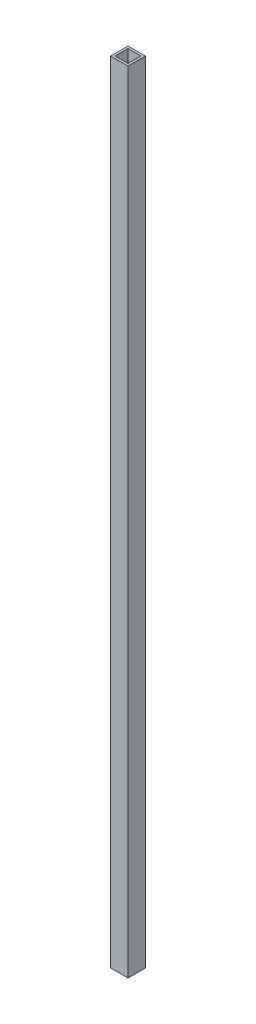
ISO-10303-21;
HEADER;
FILE_DESCRIPTION(('STEP AP214'),'2;1');
FILE_NAME('part.step','',(''),(''),'','','');
FILE_SCHEMA(('AUTOMOTIVE_DESIGN { 1 0 10303 214 1 1 1 1 }'));
ENDSEC;
DATA;
#1=APPLICATION_CONTEXT('core data for automotive mechanical design processes');
#2=APPLICATION_PROTOCOL_DEFINITION('international standard','automotive_design',2000,#1);
#3=PRODUCT_CONTEXT('',#1,'mechanical');
#4=PRODUCT('Part','Part','',(#3));
#5=PRODUCT_RELATED_PRODUCT_CATEGORY('part','',(#4));
#6=PRODUCT_DEFINITION_FORMATION('','',#4);
#7=PRODUCT_DEFINITION_CONTEXT('part definition',#1,'design');
#8=PRODUCT_DEFINITION('design','',#6,#7);
#9=PRODUCT_DEFINITION_SHAPE('','',#8);
#10=(LENGTH_UNIT() NAMED_UNIT(*) SI_UNIT(.MILLI.,.METRE.));
#11=(NAMED_UNIT(*) PLANE_ANGLE_UNIT() SI_UNIT($,.RADIAN.));
#12=(NAMED_UNIT(*) SI_UNIT($,.STERADIAN.) SOLID_ANGLE_UNIT());
#13=UNCERTAINTY_MEASURE_WITH_UNIT(LENGTH_MEASURE(1.E-05),#10,'distance_accuracy_value','');
#14=(GEOMETRIC_REPRESENTATION_CONTEXT(3) GLOBAL_UNCERTAINTY_ASSIGNED_CONTEXT((#13)) GLOBAL_UNIT_ASSIGNED_CONTEXT((#10,
#11,#12)) REPRESENTATION_CONTEXT('',''));
#15=CARTESIAN_POINT('',(0.,0.,0.));
#16=DIRECTION('',(0.,0.,1.));
#17=DIRECTION('',(1.,0.,0.));
#18=AXIS2_PLACEMENT_3D('',#15,#16,#17);
#19=CARTESIAN_POINT('',(0.,1820.,0.));
#20=DIRECTION('',(0.,1.,0.));
#21=DIRECTION('',(0.,0.,1.));
#22=AXIS2_PLACEMENT_3D('',#19,#20,#21);
#23=PLANE('',#22);
#24=DIRECTION('',(0.,0.,1.));
#25=VECTOR('',#24,1.);
#26=CARTESIAN_POINT('',(-20.,1820.,20.));
#27=LINE('',#26,#25);
#28=CARTESIAN_POINT('',(-20.,1820.,-20.));
#29=VERTEX_POINT('',#28);
#30=CARTESIAN_POINT('',(-20.,1820.,20.));
#31=VERTEX_POINT('',#30);
#32=EDGE_CURVE('E134',#29,#31,#27,.T.);
#33=ORIENTED_EDGE('',*,*,#32,.T.);
#34=DIRECTION('',(1.,0.,0.));
#35=VECTOR('',#34,1.);
#36=CARTESIAN_POINT('',(20.,1820.,20.));
#37=LINE('',#36,#35);
#38=CARTESIAN_POINT('',(20.,1820.,20.));
#39=VERTEX_POINT('',#38);
#40=EDGE_CURVE('E137',#31,#39,#37,.T.);
#41=ORIENTED_EDGE('',*,*,#40,.T.);
#42=DIRECTION('',(0.,0.,-1.));
#43=VECTOR('',#42,1.);
#44=CARTESIAN_POINT('',(20.,1820.,20.));
#45=LINE('',#44,#43);
#46=CARTESIAN_POINT('',(20.,1820.,-20.));
#47=VERTEX_POINT('',#46);
#48=EDGE_CURVE('E140',#39,#47,#45,.T.);
#49=ORIENTED_EDGE('',*,*,#48,.T.);
#50=DIRECTION('',(-1.,0.,0.));
#51=VECTOR('',#50,1.);
#52=CARTESIAN_POINT('',(20.,1820.,-20.));
#53=LINE('',#52,#51);
#54=EDGE_CURVE('E142',#47,#29,#53,.T.);
#55=ORIENTED_EDGE('',*,*,#54,.T.);
#56=EDGE_LOOP('',(#33,#41,#49,#55));
#57=FACE_BOUND('',#56,.T.);
#58=DIRECTION('',(0.,0.,-1.));
#59=VECTOR('',#58,1.);
#60=CARTESIAN_POINT('',(15.,1820.,15.));
#61=LINE('',#60,#59);
#62=CARTESIAN_POINT('',(15.,1820.,15.));
#63=VERTEX_POINT('',#62);
#64=CARTESIAN_POINT('',(15.,1820.,-15.));
#65=VERTEX_POINT('',#64);
#66=EDGE_CURVE('E106',#63,#65,#61,.T.);
#67=ORIENTED_EDGE('',*,*,#66,.F.);
#68=DIRECTION('',(1.,0.,0.));
#69=VECTOR('',#68,1.);
#70=CARTESIAN_POINT('',(15.,1820.,15.));
#71=LINE('',#70,#69);
#72=CARTESIAN_POINT('',(-15.,1820.,15.));
#73=VERTEX_POINT('',#72);
#74=EDGE_CURVE('E98',#73,#63,#71,.T.);
#75=ORIENTED_EDGE('',*,*,#74,.F.);
#76=DIRECTION('',(0.,0.,1.));
#77=VECTOR('',#76,1.);
#78=CARTESIAN_POINT('',(-15.,1820.,15.));
#79=LINE('',#78,#77);
#80=CARTESIAN_POINT('',(-15.,1820.,-15.));
#81=VERTEX_POINT('',#80);
#82=EDGE_CURVE('E120',#81,#73,#79,.T.);
#83=ORIENTED_EDGE('',*,*,#82,.F.);
#84=DIRECTION('',(-1.,0.,0.));
#85=VECTOR('',#84,1.);
#86=CARTESIAN_POINT('',(15.,1820.,-15.));
#87=LINE('',#86,#85);
#88=EDGE_CURVE('E118',#65,#81,#87,.T.);
#89=ORIENTED_EDGE('',*,*,#88,.F.);
#90=EDGE_LOOP('',(#67,#75,#83,#89));
#91=FACE_BOUND('',#90,.T.);
#92=ADVANCED_FACE('F33',(#57,#91),#23,.T.);
#93=CARTESIAN_POINT('',(0.,0.,0.));
#94=DIRECTION('',(0.,1.,0.));
#95=DIRECTION('',(0.,0.,1.));
#96=AXIS2_PLACEMENT_3D('',#93,#94,#95);
#97=PLANE('',#96);
#98=DIRECTION('',(0.,0.,1.));
#99=VECTOR('',#98,1.);
#100=CARTESIAN_POINT('',(-20.,0.,20.));
#101=LINE('',#100,#99);
#102=CARTESIAN_POINT('',(-20.,0.,-20.));
#103=VERTEX_POINT('',#102);
#104=CARTESIAN_POINT('',(-20.,0.,20.));
#105=VERTEX_POINT('',#104);
#106=EDGE_CURVE('E114',#103,#105,#101,.T.);
#107=ORIENTED_EDGE('',*,*,#106,.F.);
#108=DIRECTION('',(-1.,0.,0.));
#109=VECTOR('',#108,1.);
#110=CARTESIAN_POINT('',(20.,0.,-20.));
#111=LINE('',#110,#109);
#112=CARTESIAN_POINT('',(20.,0.,-20.));
#113=VERTEX_POINT('',#112);
#114=EDGE_CURVE('E138',#113,#103,#111,.T.);
#115=ORIENTED_EDGE('',*,*,#114,.F.);
#116=DIRECTION('',(0.,0.,-1.));
#117=VECTOR('',#116,1.);
#118=CARTESIAN_POINT('',(20.,0.,20.));
#119=LINE('',#118,#117);
#120=CARTESIAN_POINT('',(20.,0.,20.));
#121=VERTEX_POINT('',#120);
#122=EDGE_CURVE('E149',#121,#113,#119,.T.);
#123=ORIENTED_EDGE('',*,*,#122,.F.);
#124=DIRECTION('',(1.,0.,0.));
#125=VECTOR('',#124,1.);
#126=CARTESIAN_POINT('',(20.,0.,20.));
#127=LINE('',#126,#125);
#128=EDGE_CURVE('E147',#105,#121,#127,.T.);
#129=ORIENTED_EDGE('',*,*,#128,.F.);
#130=EDGE_LOOP('',(#107,#115,#123,#129));
#131=FACE_BOUND('',#130,.T.);
#132=DIRECTION('',(1.,0.,0.));
#133=VECTOR('',#132,1.);
#134=CARTESIAN_POINT('',(15.,0.,15.));
#135=LINE('',#134,#133);
#136=CARTESIAN_POINT('',(-15.,0.,15.));
#137=VERTEX_POINT('',#136);
#138=CARTESIAN_POINT('',(15.,0.,15.));
#139=VERTEX_POINT('',#138);
#140=EDGE_CURVE('E56',#137,#139,#135,.T.);
#141=ORIENTED_EDGE('',*,*,#140,.T.);
#142=DIRECTION('',(0.,0.,-1.));
#143=VECTOR('',#142,1.);
#144=CARTESIAN_POINT('',(15.,0.,15.));
#145=LINE('',#144,#143);
#146=CARTESIAN_POINT('',(15.,0.,-15.));
#147=VERTEX_POINT('',#146);
#148=EDGE_CURVE('E113',#139,#147,#145,.T.);
#149=ORIENTED_EDGE('',*,*,#148,.T.);
#150=DIRECTION('',(-1.,0.,0.));
#151=VECTOR('',#150,1.);
#152=CARTESIAN_POINT('',(15.,0.,-15.));
#153=LINE('',#152,#151);
#154=CARTESIAN_POINT('',(-15.,0.,-15.));
#155=VERTEX_POINT('',#154);
#156=EDGE_CURVE('E126',#147,#155,#153,.T.);
#157=ORIENTED_EDGE('',*,*,#156,.T.);
#158=DIRECTION('',(0.,0.,1.));
#159=VECTOR('',#158,1.);
#160=CARTESIAN_POINT('',(-15.,0.,15.));
#161=LINE('',#160,#159);
#162=EDGE_CURVE('E107',#155,#137,#161,.T.);
#163=ORIENTED_EDGE('',*,*,#162,.T.);
#164=EDGE_LOOP('',(#141,#149,#157,#163));
#165=FACE_BOUND('',#164,.T.);
#166=ADVANCED_FACE('F167',(#131,#165),#97,.F.);
#167=CARTESIAN_POINT('',(-20.,1820.,20.));
#168=DIRECTION('',(1.,0.,0.));
#169=DIRECTION('',(0.,0.,-1.));
#170=AXIS2_PLACEMENT_3D('',#167,#168,#169);
#171=PLANE('',#170);
#172=ORIENTED_EDGE('',*,*,#106,.T.);
#173=DIRECTION('',(0.,-1.,0.));
#174=VECTOR('',#173,1.);
#175=CARTESIAN_POINT('',(-20.,1820.,20.));
#176=LINE('',#175,#174);
#177=EDGE_CURVE('E11',#31,#105,#176,.T.);
#178=ORIENTED_EDGE('',*,*,#177,.F.);
#179=ORIENTED_EDGE('',*,*,#32,.F.);
#180=DIRECTION('',(0.,-1.,0.));
#181=VECTOR('',#180,1.);
#182=CARTESIAN_POINT('',(-20.,1820.,-20.));
#183=LINE('',#182,#181);
#184=EDGE_CURVE('E144',#29,#103,#183,.T.);
#185=ORIENTED_EDGE('',*,*,#184,.T.);
#186=EDGE_LOOP('',(#172,#178,#179,#185));
#187=FACE_BOUND('',#186,.T.);
#188=ADVANCED_FACE('F35',(#187),#171,.F.);
#189=CARTESIAN_POINT('',(20.,1820.,20.));
#190=DIRECTION('',(0.,0.,-1.));
#191=DIRECTION('',(-1.,0.,0.));
#192=AXIS2_PLACEMENT_3D('',#189,#190,#191);
#193=PLANE('',#192);
#194=ORIENTED_EDGE('',*,*,#128,.T.);
#195=DIRECTION('',(0.,-1.,0.));
#196=VECTOR('',#195,1.);
#197=CARTESIAN_POINT('',(20.,1820.,20.));
#198=LINE('',#197,#196);
#199=EDGE_CURVE('E41',#39,#121,#198,.T.);
#200=ORIENTED_EDGE('',*,*,#199,.F.);
#201=ORIENTED_EDGE('',*,*,#40,.F.);
#202=ORIENTED_EDGE('',*,*,#177,.T.);
#203=EDGE_LOOP('',(#194,#200,#201,#202));
#204=FACE_BOUND('',#203,.T.);
#205=ADVANCED_FACE('F177',(#204),#193,.F.);
#206=CARTESIAN_POINT('',(20.,1820.,20.));
#207=DIRECTION('',(-1.,0.,0.));
#208=DIRECTION('',(0.,0.,1.));
#209=AXIS2_PLACEMENT_3D('',#206,#207,#208);
#210=PLANE('',#209);
#211=ORIENTED_EDGE('',*,*,#122,.T.);
#212=DIRECTION('',(0.,-1.,0.));
#213=VECTOR('',#212,1.);
#214=CARTESIAN_POINT('',(20.,1820.,-20.));
#215=LINE('',#214,#213);
#216=EDGE_CURVE('E154',#47,#113,#215,.T.);
#217=ORIENTED_EDGE('',*,*,#216,.F.);
#218=ORIENTED_EDGE('',*,*,#48,.F.);
#219=ORIENTED_EDGE('',*,*,#199,.T.);
#220=EDGE_LOOP('',(#211,#217,#218,#219));
#221=FACE_BOUND('',#220,.T.);
#222=ADVANCED_FACE('F161',(#221),#210,.F.);
#223=CARTESIAN_POINT('',(20.,1820.,-20.));
#224=DIRECTION('',(0.,0.,1.));
#225=DIRECTION('',(1.,0.,0.));
#226=AXIS2_PLACEMENT_3D('',#223,#224,#225);
#227=PLANE('',#226);
#228=ORIENTED_EDGE('',*,*,#114,.T.);
#229=ORIENTED_EDGE('',*,*,#184,.F.);
#230=ORIENTED_EDGE('',*,*,#54,.F.);
#231=ORIENTED_EDGE('',*,*,#216,.T.);
#232=EDGE_LOOP('',(#228,#229,#230,#231));
#233=FACE_BOUND('',#232,.T.);
#234=ADVANCED_FACE('F171',(#233),#227,.F.);
#235=CARTESIAN_POINT('',(15.,1820.,15.));
#236=DIRECTION('',(0.,0.,-1.));
#237=DIRECTION('',(-1.,0.,0.));
#238=AXIS2_PLACEMENT_3D('',#235,#236,#237);
#239=PLANE('',#238);
#240=ORIENTED_EDGE('',*,*,#140,.F.);
#241=DIRECTION('',(0.,-1.,0.));
#242=VECTOR('',#241,1.);
#243=CARTESIAN_POINT('',(-15.,1820.,15.));
#244=LINE('',#243,#242);
#245=EDGE_CURVE('E102',#73,#137,#244,.T.);
#246=ORIENTED_EDGE('',*,*,#245,.F.);
#247=ORIENTED_EDGE('',*,*,#74,.T.);
#248=DIRECTION('',(0.,-1.,0.));
#249=VECTOR('',#248,1.);
#250=CARTESIAN_POINT('',(15.,1820.,15.));
#251=LINE('',#250,#249);
#252=EDGE_CURVE('E101',#63,#139,#251,.T.);
#253=ORIENTED_EDGE('',*,*,#252,.T.);
#254=EDGE_LOOP('',(#240,#246,#247,#253));
#255=FACE_BOUND('',#254,.T.);
#256=ADVANCED_FACE('F100',(#255),#239,.T.);
#257=CARTESIAN_POINT('',(15.,1820.,15.));
#258=DIRECTION('',(-1.,0.,0.));
#259=DIRECTION('',(0.,0.,1.));
#260=AXIS2_PLACEMENT_3D('',#257,#258,#259);
#261=PLANE('',#260);
#262=ORIENTED_EDGE('',*,*,#148,.F.);
#263=ORIENTED_EDGE('',*,*,#252,.F.);
#264=ORIENTED_EDGE('',*,*,#66,.T.);
#265=DIRECTION('',(0.,-1.,0.));
#266=VECTOR('',#265,1.);
#267=CARTESIAN_POINT('',(15.,1820.,-15.));
#268=LINE('',#267,#266);
#269=EDGE_CURVE('E115',#65,#147,#268,.T.);
#270=ORIENTED_EDGE('',*,*,#269,.T.);
#271=EDGE_LOOP('',(#262,#263,#264,#270));
#272=FACE_BOUND('',#271,.T.);
#273=ADVANCED_FACE('F110',(#272),#261,.T.);
#274=CARTESIAN_POINT('',(15.,1820.,-15.));
#275=DIRECTION('',(0.,0.,1.));
#276=DIRECTION('',(1.,0.,0.));
#277=AXIS2_PLACEMENT_3D('',#274,#275,#276);
#278=PLANE('',#277);
#279=ORIENTED_EDGE('',*,*,#156,.F.);
#280=ORIENTED_EDGE('',*,*,#269,.F.);
#281=ORIENTED_EDGE('',*,*,#88,.T.);
#282=DIRECTION('',(0.,-1.,0.));
#283=VECTOR('',#282,1.);
#284=CARTESIAN_POINT('',(-15.,1820.,-15.));
#285=LINE('',#284,#283);
#286=EDGE_CURVE('E48',#81,#155,#285,.T.);
#287=ORIENTED_EDGE('',*,*,#286,.T.);
#288=EDGE_LOOP('',(#279,#280,#281,#287));
#289=FACE_BOUND('',#288,.T.);
#290=ADVANCED_FACE('F200',(#289),#278,.T.);
#291=CARTESIAN_POINT('',(-15.,1820.,15.));
#292=DIRECTION('',(1.,0.,0.));
#293=DIRECTION('',(0.,0.,-1.));
#294=AXIS2_PLACEMENT_3D('',#291,#292,#293);
#295=PLANE('',#294);
#296=ORIENTED_EDGE('',*,*,#162,.F.);
#297=ORIENTED_EDGE('',*,*,#286,.F.);
#298=ORIENTED_EDGE('',*,*,#82,.T.);
#299=ORIENTED_EDGE('',*,*,#245,.T.);
#300=EDGE_LOOP('',(#296,#297,#298,#299));
#301=FACE_BOUND('',#300,.T.);
#302=ADVANCED_FACE('F204',(#301),#295,.T.);
#303=CLOSED_SHELL('',(#92,#166,#188,#205,#222,#234,#256,#273,#290,#302));
#304=MANIFOLD_SOLID_BREP('B2',#303);
#305=ADVANCED_BREP_SHAPE_REPRESENTATION('',(#18,#304),#14);
#306=SHAPE_DEFINITION_REPRESENTATION(#9,#305);
ENDSEC;
END-ISO-10303-21;
